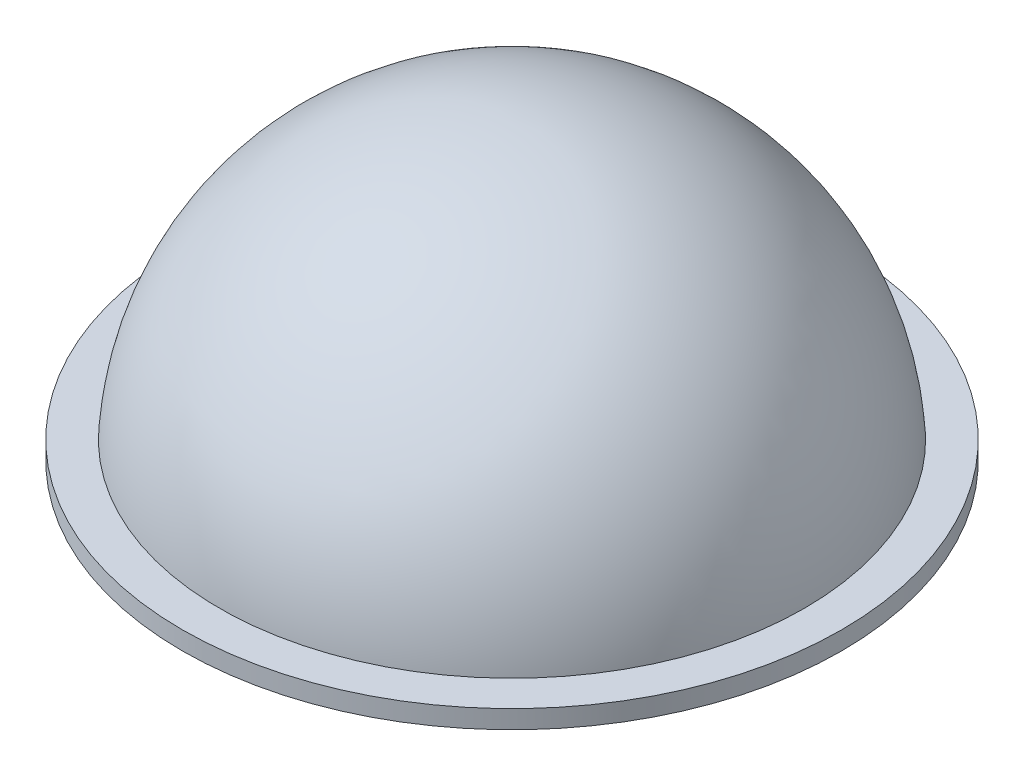
ISO-10303-21;
HEADER;
FILE_DESCRIPTION(('STEP AP214'),'2;1');
FILE_NAME('part.step','',(''),(''),'','','');
FILE_SCHEMA(('AUTOMOTIVE_DESIGN { 1 0 10303 214 1 1 1 1 }'));
ENDSEC;
DATA;
#1=APPLICATION_CONTEXT('core data for automotive mechanical design processes');
#2=APPLICATION_PROTOCOL_DEFINITION('international standard','automotive_design',2000,#1);
#3=PRODUCT_CONTEXT('',#1,'mechanical');
#4=PRODUCT('Part','Part','',(#3));
#5=PRODUCT_RELATED_PRODUCT_CATEGORY('part','',(#4));
#6=PRODUCT_DEFINITION_FORMATION('','',#4);
#7=PRODUCT_DEFINITION_CONTEXT('part definition',#1,'design');
#8=PRODUCT_DEFINITION('design','',#6,#7);
#9=PRODUCT_DEFINITION_SHAPE('','',#8);
#10=(LENGTH_UNIT() NAMED_UNIT(*) SI_UNIT(.MILLI.,.METRE.));
#11=(NAMED_UNIT(*) PLANE_ANGLE_UNIT() SI_UNIT($,.RADIAN.));
#12=(NAMED_UNIT(*) SI_UNIT($,.STERADIAN.) SOLID_ANGLE_UNIT());
#13=UNCERTAINTY_MEASURE_WITH_UNIT(LENGTH_MEASURE(1.E-05),#10,'distance_accuracy_value','');
#14=(GEOMETRIC_REPRESENTATION_CONTEXT(3) GLOBAL_UNCERTAINTY_ASSIGNED_CONTEXT((#13)) GLOBAL_UNIT_ASSIGNED_CONTEXT((#10,
#11,#12)) REPRESENTATION_CONTEXT('',''));
#15=CARTESIAN_POINT('',(0.,0.,0.));
#16=DIRECTION('',(0.,0.,1.));
#17=DIRECTION('',(1.,0.,0.));
#18=AXIS2_PLACEMENT_3D('',#15,#16,#17);
#19=CARTESIAN_POINT('',(-90.,0.,0.));
#20=DIRECTION('',(0.,1.,0.));
#21=DIRECTION('',(-1.,0.,0.));
#22=AXIS2_PLACEMENT_3D('',#19,#20,#21);
#23=PLANE('',#22);
#24=CARTESIAN_POINT('',(0.,0.,0.));
#25=DIRECTION('',(0.,-1.,0.));
#26=DIRECTION('',(1.,0.,0.));
#27=AXIS2_PLACEMENT_3D('',#24,#25,#26);
#28=CIRCLE('',#27,75.);
#29=CARTESIAN_POINT('',(75.,0.,0.));
#30=VERTEX_POINT('',#29);
#31=EDGE_CURVE('E10',#30,#30,#28,.T.);
#32=ORIENTED_EDGE('',*,*,#31,.F.);
#33=EDGE_LOOP('',(#32));
#34=FACE_BOUND('',#33,.T.);
#35=CARTESIAN_POINT('',(0.,0.,0.));
#36=DIRECTION('',(0.,-1.,0.));
#37=DIRECTION('',(1.,0.,0.));
#38=AXIS2_PLACEMENT_3D('',#35,#36,#37);
#39=CIRCLE('',#38,90.);
#40=CARTESIAN_POINT('',(90.,0.,0.));
#41=VERTEX_POINT('',#40);
#42=EDGE_CURVE('E45',#41,#41,#39,.T.);
#43=ORIENTED_EDGE('',*,*,#42,.T.);
#44=EDGE_LOOP('',(#43));
#45=FACE_BOUND('',#44,.T.);
#46=ADVANCED_FACE('F31',(#34,#45),#23,.F.);
#47=CARTESIAN_POINT('',(0.,0.,0.));
#48=DIRECTION('',(0.,-1.,0.));
#49=DIRECTION('',(-1.,0.,0.));
#50=AXIS2_PLACEMENT_3D('',#47,#48,#49);
#51=SPHERICAL_SURFACE('',#50,75.);
#52=ORIENTED_EDGE('',*,*,#31,.T.);
#53=EDGE_LOOP('',(#52));
#54=FACE_BOUND('',#53,.T.);
#55=ADVANCED_FACE('F65',(#54),#51,.F.);
#56=CARTESIAN_POINT('',(0.,0.,0.));
#57=DIRECTION('',(0.,-1.,0.));
#58=DIRECTION('',(-1.,0.,0.));
#59=AXIS2_PLACEMENT_3D('',#56,#57,#58);
#60=SPHERICAL_SURFACE('',#59,80.);
#61=CARTESIAN_POINT('',(0.,4.99999999999999,0.));
#62=DIRECTION('',(0.,-1.,0.));
#63=DIRECTION('',(1.,0.,0.));
#64=AXIS2_PLACEMENT_3D('',#61,#62,#63);
#65=CIRCLE('',#64,79.8435971133566);
#66=CARTESIAN_POINT('',(79.8435971133566,4.99999999999997,0.));
#67=VERTEX_POINT('',#66);
#68=EDGE_CURVE('E37',#67,#67,#65,.T.);
#69=ORIENTED_EDGE('',*,*,#68,.F.);
#70=EDGE_LOOP('',(#69));
#71=FACE_BOUND('',#70,.T.);
#72=ADVANCED_FACE('F60',(#71),#60,.T.);
#73=CARTESIAN_POINT('',(-90.,5.,0.));
#74=DIRECTION('',(0.,-1.,0.));
#75=DIRECTION('',(1.,0.,0.));
#76=AXIS2_PLACEMENT_3D('',#73,#74,#75);
#77=PLANE('',#76);
#78=CARTESIAN_POINT('',(0.,4.99999999999998,0.));
#79=DIRECTION('',(0.,-1.,0.));
#80=DIRECTION('',(1.,0.,0.));
#81=AXIS2_PLACEMENT_3D('',#78,#79,#80);
#82=CIRCLE('',#81,90.);
#83=CARTESIAN_POINT('',(90.,4.99999999999997,0.));
#84=VERTEX_POINT('',#83);
#85=EDGE_CURVE('E41',#84,#84,#82,.T.);
#86=ORIENTED_EDGE('',*,*,#85,.F.);
#87=EDGE_LOOP('',(#86));
#88=FACE_BOUND('',#87,.T.);
#89=ORIENTED_EDGE('',*,*,#68,.T.);
#90=EDGE_LOOP('',(#89));
#91=FACE_BOUND('',#90,.T.);
#92=ADVANCED_FACE('F55',(#88,#91),#77,.F.);
#93=CARTESIAN_POINT('',(0.,0.,0.));
#94=DIRECTION('',(0.,-1.,0.));
#95=DIRECTION('',(1.,0.,0.));
#96=AXIS2_PLACEMENT_3D('',#93,#94,#95);
#97=CYLINDRICAL_SURFACE('',#96,90.);
#98=ORIENTED_EDGE('',*,*,#42,.F.);
#99=EDGE_LOOP('',(#98));
#100=FACE_BOUND('',#99,.T.);
#101=ORIENTED_EDGE('',*,*,#85,.T.);
#102=EDGE_LOOP('',(#101));
#103=FACE_BOUND('',#102,.T.);
#104=ADVANCED_FACE('F52',(#100,#103),#97,.T.);
#105=CLOSED_SHELL('',(#46,#55,#72,#92,#104));
#106=MANIFOLD_SOLID_BREP('B2',#105);
#107=ADVANCED_BREP_SHAPE_REPRESENTATION('',(#18,#106),#14);
#108=SHAPE_DEFINITION_REPRESENTATION(#9,#107);
ENDSEC;
END-ISO-10303-21;
